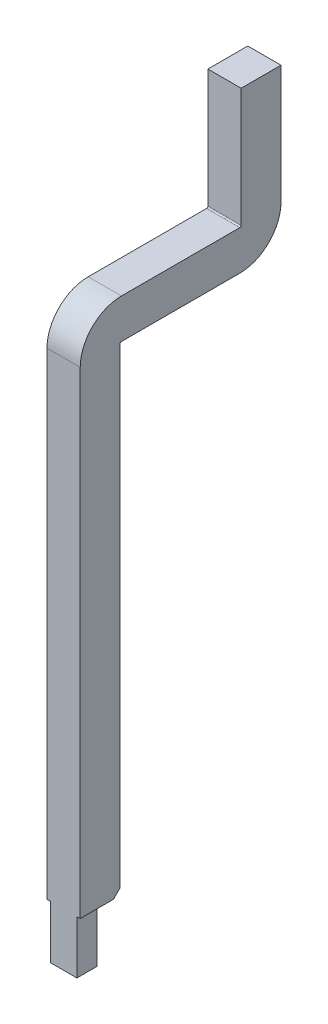
ISO-10303-21;
HEADER;
FILE_DESCRIPTION(('STEP AP214'),'2;1');
FILE_NAME('part.step','',(''),(''),'','','');
FILE_SCHEMA(('AUTOMOTIVE_DESIGN { 1 0 10303 214 1 1 1 1 }'));
ENDSEC;
DATA;
#1=APPLICATION_CONTEXT('core data for automotive mechanical design processes');
#2=APPLICATION_PROTOCOL_DEFINITION('international standard','automotive_design',2000,#1);
#3=PRODUCT_CONTEXT('',#1,'mechanical');
#4=PRODUCT('Part','Part','',(#3));
#5=PRODUCT_RELATED_PRODUCT_CATEGORY('part','',(#4));
#6=PRODUCT_DEFINITION_FORMATION('','',#4);
#7=PRODUCT_DEFINITION_CONTEXT('part definition',#1,'design');
#8=PRODUCT_DEFINITION('design','',#6,#7);
#9=PRODUCT_DEFINITION_SHAPE('','',#8);
#10=(LENGTH_UNIT() NAMED_UNIT(*) SI_UNIT(.MILLI.,.METRE.));
#11=(NAMED_UNIT(*) PLANE_ANGLE_UNIT() SI_UNIT($,.RADIAN.));
#12=(NAMED_UNIT(*) SI_UNIT($,.STERADIAN.) SOLID_ANGLE_UNIT());
#13=UNCERTAINTY_MEASURE_WITH_UNIT(LENGTH_MEASURE(1.E-05),#10,'distance_accuracy_value','');
#14=(GEOMETRIC_REPRESENTATION_CONTEXT(3) GLOBAL_UNCERTAINTY_ASSIGNED_CONTEXT((#13)) GLOBAL_UNIT_ASSIGNED_CONTEXT((#10,
#11,#12)) REPRESENTATION_CONTEXT('',''));
#15=CARTESIAN_POINT('',(0.,0.,0.));
#16=DIRECTION('',(0.,0.,1.));
#17=DIRECTION('',(1.,0.,0.));
#18=AXIS2_PLACEMENT_3D('',#15,#16,#17);
#19=CARTESIAN_POINT('',(0.,-2.196565371946,0.));
#20=DIRECTION('',(0.,-1.,0.));
#21=DIRECTION('',(0.,0.,-1.));
#22=AXIS2_PLACEMENT_3D('',#19,#20,#21);
#23=PLANE('',#22);
#24=DIRECTION('',(1.,0.,0.));
#25=VECTOR('',#24,1.);
#26=CARTESIAN_POINT('',(-0.1,-2.196565371946,0.605));
#27=LINE('',#26,#25);
#28=CARTESIAN_POINT('',(-0.1,-2.196565371946,0.605));
#29=VERTEX_POINT('',#28);
#30=CARTESIAN_POINT('',(0.1,-2.196565371946,0.605));
#31=VERTEX_POINT('',#30);
#32=EDGE_CURVE('E216',#29,#31,#27,.T.);
#33=ORIENTED_EDGE('',*,*,#32,.T.);
#34=DIRECTION('',(0.,0.,1.));
#35=VECTOR('',#34,1.);
#36=CARTESIAN_POINT('',(0.1,-2.196565371946,0.605));
#37=LINE('',#36,#35);
#38=CARTESIAN_POINT('',(0.1,-2.196565371946,0.755));
#39=VERTEX_POINT('',#38);
#40=EDGE_CURVE('E213',#31,#39,#37,.T.);
#41=ORIENTED_EDGE('',*,*,#40,.T.);
#42=DIRECTION('',(1.,0.,0.));
#43=VECTOR('',#42,1.);
#44=CARTESIAN_POINT('',(0.125,-2.196565371946,0.755));
#45=LINE('',#44,#43);
#46=CARTESIAN_POINT('',(-0.1,-2.196565371946,0.755));
#47=VERTEX_POINT('',#46);
#48=EDGE_CURVE('E174',#47,#39,#45,.T.);
#49=ORIENTED_EDGE('',*,*,#48,.F.);
#50=DIRECTION('',(0.,0.,-1.));
#51=VECTOR('',#50,1.);
#52=CARTESIAN_POINT('',(-0.1,-2.196565371946,0.755));
#53=LINE('',#52,#51);
#54=EDGE_CURVE('E226',#47,#29,#53,.T.);
#55=ORIENTED_EDGE('',*,*,#54,.T.);
#56=EDGE_LOOP('',(#33,#41,#49,#55));
#57=FACE_BOUND('',#56,.T.);
#58=ADVANCED_FACE('F17',(#57),#23,.T.);
#59=CARTESIAN_POINT('',(-0.125,1.793434628054,0.445));
#60=DIRECTION('',(-1.,0.,0.));
#61=DIRECTION('',(0.,0.,1.));
#62=AXIS2_PLACEMENT_3D('',#59,#60,#61);
#63=PLANE('',#62);
#64=DIRECTION('',(0.,0.,-1.));
#65=VECTOR('',#64,1.);
#66=CARTESIAN_POINT('',(-0.125,1.806565371946,-0.445));
#67=LINE('',#66,#65);
#68=CARTESIAN_POINT('',(-0.125,1.806565371946,0.445));
#69=VERTEX_POINT('',#68);
#70=CARTESIAN_POINT('',(-0.125,1.806565371946,-0.445));
#71=VERTEX_POINT('',#70);
#72=EDGE_CURVE('E191',#69,#71,#67,.T.);
#73=ORIENTED_EDGE('',*,*,#72,.F.);
#74=CARTESIAN_POINT('',(-0.125,1.796565371946,0.445));
#75=DIRECTION('',(1.,0.,0.));
#76=DIRECTION('',(0.,0.,-1.));
#77=AXIS2_PLACEMENT_3D('',#74,#75,#76);
#78=CIRCLE('',#77,0.01);
#79=CARTESIAN_POINT('',(-0.125,1.796565371946,0.455));
#80=VERTEX_POINT('',#79);
#81=EDGE_CURVE('E184',#69,#80,#78,.T.);
#82=ORIENTED_EDGE('',*,*,#81,.T.);
#83=DIRECTION('',(0.,1.,0.));
#84=VECTOR('',#83,1.);
#85=CARTESIAN_POINT('',(-0.125,1.796565371946,0.455));
#86=LINE('',#85,#84);
#87=CARTESIAN_POINT('',(-0.125,-1.746565371946,0.455));
#88=VERTEX_POINT('',#87);
#89=EDGE_CURVE('E181',#88,#80,#86,.T.);
#90=ORIENTED_EDGE('',*,*,#89,.F.);
#91=DIRECTION('',(0.,-0.707106781186548,0.707106781186547));
#92=VECTOR('',#91,1.);
#93=CARTESIAN_POINT('',(-0.125,-1.746565371946,0.455));
#94=LINE('',#93,#92);
#95=CARTESIAN_POINT('',(-0.125,-1.796565371946,0.505));
#96=VERTEX_POINT('',#95);
#97=EDGE_CURVE('E187',#88,#96,#94,.T.);
#98=ORIENTED_EDGE('',*,*,#97,.T.);
#99=DIRECTION('',(0.,0.,1.));
#100=VECTOR('',#99,1.);
#101=CARTESIAN_POINT('',(-0.125,-1.796565371946,0.445));
#102=LINE('',#101,#100);
#103=CARTESIAN_POINT('',(-0.125,-1.796565371946,0.755));
#104=VERTEX_POINT('',#103);
#105=EDGE_CURVE('E149',#96,#104,#102,.T.);
#106=ORIENTED_EDGE('',*,*,#105,.T.);
#107=DIRECTION('',(0.,-1.,0.));
#108=VECTOR('',#107,1.);
#109=CARTESIAN_POINT('',(-0.125,-1.796565371946,0.755));
#110=LINE('',#109,#108);
#111=CARTESIAN_POINT('',(-0.125,1.793434628054,0.755));
#112=VERTEX_POINT('',#111);
#113=EDGE_CURVE('E147',#112,#104,#110,.T.);
#114=ORIENTED_EDGE('',*,*,#113,.F.);
#115=CARTESIAN_POINT('',(-0.125,1.793434628054,0.445));
#116=DIRECTION('',(1.,0.,0.));
#117=DIRECTION('',(0.,0.,-1.));
#118=AXIS2_PLACEMENT_3D('',#115,#116,#117);
#119=CIRCLE('',#118,0.31);
#120=CARTESIAN_POINT('',(-0.125,2.103434628054,0.445));
#121=VERTEX_POINT('',#120);
#122=EDGE_CURVE('E20',#121,#112,#119,.T.);
#123=ORIENTED_EDGE('',*,*,#122,.F.);
#124=DIRECTION('',(0.,0.,1.));
#125=VECTOR('',#124,1.);
#126=CARTESIAN_POINT('',(-0.125,2.103434628054,0.445));
#127=LINE('',#126,#125);
#128=CARTESIAN_POINT('',(-0.125,2.103434628054,-0.445));
#129=VERTEX_POINT('',#128);
#130=EDGE_CURVE('E132',#129,#121,#127,.T.);
#131=ORIENTED_EDGE('',*,*,#130,.F.);
#132=CARTESIAN_POINT('',(-0.125,2.113434628054,-0.445));
#133=DIRECTION('',(1.,0.,0.));
#134=DIRECTION('',(0.,0.,-1.));
#135=AXIS2_PLACEMENT_3D('',#132,#133,#134);
#136=CIRCLE('',#135,0.01);
#137=CARTESIAN_POINT('',(-0.125,2.113434628054,-0.455));
#138=VERTEX_POINT('',#137);
#139=EDGE_CURVE('E208',#129,#138,#136,.T.);
#140=ORIENTED_EDGE('',*,*,#139,.T.);
#141=DIRECTION('',(0.,1.,0.));
#142=VECTOR('',#141,1.);
#143=CARTESIAN_POINT('',(-0.125,2.113434628054,-0.455));
#144=LINE('',#143,#142);
#145=CARTESIAN_POINT('',(-0.125,3.006565371946,-0.455));
#146=VERTEX_POINT('',#145);
#147=EDGE_CURVE('E206',#146,#138,#144,.F.);
#148=ORIENTED_EDGE('',*,*,#147,.F.);
#149=DIRECTION('',(0.,0.,1.));
#150=VECTOR('',#149,1.);
#151=CARTESIAN_POINT('',(-0.125,3.006565371946,-0.455));
#152=LINE('',#151,#150);
#153=CARTESIAN_POINT('',(-0.125,3.006565371946,-0.755));
#154=VERTEX_POINT('',#153);
#155=EDGE_CURVE('E201',#154,#146,#152,.T.);
#156=ORIENTED_EDGE('',*,*,#155,.F.);
#157=DIRECTION('',(0.,1.,0.));
#158=VECTOR('',#157,1.);
#159=CARTESIAN_POINT('',(-0.125,3.006565371946,-0.755));
#160=LINE('',#159,#158);
#161=CARTESIAN_POINT('',(-0.125,2.116565371946,-0.755));
#162=VERTEX_POINT('',#161);
#163=EDGE_CURVE('E195',#162,#154,#160,.T.);
#164=ORIENTED_EDGE('',*,*,#163,.F.);
#165=CARTESIAN_POINT('',(-0.125,2.116565371946,-0.445));
#166=DIRECTION('',(1.,0.,0.));
#167=DIRECTION('',(0.,0.,-1.));
#168=AXIS2_PLACEMENT_3D('',#165,#166,#167);
#169=CIRCLE('',#168,0.31);
#170=EDGE_CURVE('E278',#71,#162,#169,.T.);
#171=ORIENTED_EDGE('',*,*,#170,.F.);
#172=EDGE_LOOP('',(#73,#82,#90,#98,#106,#114,#123,#131,#140,#148,#156,#164,#171));
#173=FACE_BOUND('',#172,.T.);
#174=ADVANCED_FACE('F148',(#173),#63,.T.);
#175=CARTESIAN_POINT('',(0.1,-2.196565371946,0.605));
#176=DIRECTION('',(-1.,0.,0.));
#177=DIRECTION('',(0.,0.,1.));
#178=AXIS2_PLACEMENT_3D('',#175,#176,#177);
#179=PLANE('',#178);
#180=DIRECTION('',(0.,-1.,0.));
#181=VECTOR('',#180,1.);
#182=CARTESIAN_POINT('',(0.1,-1.796565371946,0.755));
#183=LINE('',#182,#181);
#184=CARTESIAN_POINT('',(0.1,-1.796565371946,0.755));
#185=VERTEX_POINT('',#184);
#186=EDGE_CURVE('E145',#39,#185,#183,.F.);
#187=ORIENTED_EDGE('',*,*,#186,.F.);
#188=ORIENTED_EDGE('',*,*,#40,.F.);
#189=DIRECTION('',(0.,1.,0.));
#190=VECTOR('',#189,1.);
#191=CARTESIAN_POINT('',(0.1,-2.196565371946,0.605));
#192=LINE('',#191,#190);
#193=CARTESIAN_POINT('',(0.1,-1.796565371946,0.605));
#194=VERTEX_POINT('',#193);
#195=EDGE_CURVE('E229',#31,#194,#192,.T.);
#196=ORIENTED_EDGE('',*,*,#195,.T.);
#197=DIRECTION('',(0.,0.,-1.));
#198=VECTOR('',#197,1.);
#199=CARTESIAN_POINT('',(0.1,-1.796565371946,0.455));
#200=LINE('',#199,#198);
#201=EDGE_CURVE('E168',#185,#194,#200,.T.);
#202=ORIENTED_EDGE('',*,*,#201,.F.);
#203=EDGE_LOOP('',(#187,#188,#196,#202));
#204=FACE_BOUND('',#203,.T.);
#205=ADVANCED_FACE('F503',(#204),#179,.F.);
#206=CARTESIAN_POINT('',(-0.1,-2.196565371946,0.605));
#207=DIRECTION('',(0.,0.,1.));
#208=DIRECTION('',(1.,0.,0.));
#209=AXIS2_PLACEMENT_3D('',#206,#207,#208);
#210=PLANE('',#209);
#211=ORIENTED_EDGE('',*,*,#195,.F.);
#212=ORIENTED_EDGE('',*,*,#32,.F.);
#213=DIRECTION('',(0.,1.,0.));
#214=VECTOR('',#213,1.);
#215=CARTESIAN_POINT('',(-0.1,-2.196565371946,0.605));
#216=LINE('',#215,#214);
#217=CARTESIAN_POINT('',(-0.1,-1.796565371946,0.605));
#218=VERTEX_POINT('',#217);
#219=EDGE_CURVE('E154',#29,#218,#216,.T.);
#220=ORIENTED_EDGE('',*,*,#219,.T.);
#221=DIRECTION('',(1.,0.,0.));
#222=VECTOR('',#221,1.);
#223=CARTESIAN_POINT('',(0.125,-1.796565371946,0.605));
#224=LINE('',#223,#222);
#225=EDGE_CURVE('E178',#194,#218,#224,.F.);
#226=ORIENTED_EDGE('',*,*,#225,.F.);
#227=EDGE_LOOP('',(#211,#212,#220,#226));
#228=FACE_BOUND('',#227,.T.);
#229=ADVANCED_FACE('F494',(#228),#210,.F.);
#230=CARTESIAN_POINT('',(-0.1,-2.196565371946,0.755));
#231=DIRECTION('',(1.,0.,0.));
#232=DIRECTION('',(0.,0.,-1.));
#233=AXIS2_PLACEMENT_3D('',#230,#231,#232);
#234=PLANE('',#233);
#235=ORIENTED_EDGE('',*,*,#219,.F.);
#236=ORIENTED_EDGE('',*,*,#54,.F.);
#237=DIRECTION('',(0.,-1.,0.));
#238=VECTOR('',#237,1.);
#239=CARTESIAN_POINT('',(-0.1,-1.796565371946,0.755));
#240=LINE('',#239,#238);
#241=CARTESIAN_POINT('',(-0.1,-1.796565371946,0.755));
#242=VERTEX_POINT('',#241);
#243=EDGE_CURVE('E153',#242,#47,#240,.T.);
#244=ORIENTED_EDGE('',*,*,#243,.F.);
#245=DIRECTION('',(0.,0.,-1.));
#246=VECTOR('',#245,1.);
#247=CARTESIAN_POINT('',(-0.1,-1.796565371946,0.455));
#248=LINE('',#247,#246);
#249=EDGE_CURVE('E232',#218,#242,#248,.F.);
#250=ORIENTED_EDGE('',*,*,#249,.F.);
#251=EDGE_LOOP('',(#235,#236,#244,#250));
#252=FACE_BOUND('',#251,.T.);
#253=ADVANCED_FACE('F486',(#252),#234,.F.);
#254=CARTESIAN_POINT('',(0.125,-1.796565371946,0.755));
#255=DIRECTION('',(0.,0.,1.));
#256=DIRECTION('',(0.,-1.,0.));
#257=AXIS2_PLACEMENT_3D('',#254,#255,#256);
#258=PLANE('',#257);
#259=DIRECTION('',(0.,1.,0.));
#260=VECTOR('',#259,1.);
#261=CARTESIAN_POINT('',(0.125,1.793434628054,0.755));
#262=LINE('',#261,#260);
#263=CARTESIAN_POINT('',(0.125,-1.796565371946,0.755));
#264=VERTEX_POINT('',#263);
#265=CARTESIAN_POINT('',(0.125,1.793434628054,0.755));
#266=VERTEX_POINT('',#265);
#267=EDGE_CURVE('E159',#264,#266,#262,.T.);
#268=ORIENTED_EDGE('',*,*,#267,.T.);
#269=DIRECTION('',(1.,0.,0.));
#270=VECTOR('',#269,1.);
#271=CARTESIAN_POINT('',(0.125,1.793434628054,0.755));
#272=LINE('',#271,#270);
#273=EDGE_CURVE('E141',#112,#266,#272,.T.);
#274=ORIENTED_EDGE('',*,*,#273,.F.);
#275=ORIENTED_EDGE('',*,*,#113,.T.);
#276=DIRECTION('',(1.,0.,0.));
#277=VECTOR('',#276,1.);
#278=CARTESIAN_POINT('',(0.125,-1.796565371946,0.755));
#279=LINE('',#278,#277);
#280=EDGE_CURVE('E234',#242,#104,#279,.F.);
#281=ORIENTED_EDGE('',*,*,#280,.F.);
#282=ORIENTED_EDGE('',*,*,#243,.T.);
#283=ORIENTED_EDGE('',*,*,#48,.T.);
#284=ORIENTED_EDGE('',*,*,#186,.T.);
#285=DIRECTION('',(1.,0.,0.));
#286=VECTOR('',#285,1.);
#287=CARTESIAN_POINT('',(0.125,-1.796565371946,0.755));
#288=LINE('',#287,#286);
#289=EDGE_CURVE('E165',#264,#185,#288,.F.);
#290=ORIENTED_EDGE('',*,*,#289,.F.);
#291=EDGE_LOOP('',(#268,#274,#275,#281,#282,#283,#284,#290));
#292=FACE_BOUND('',#291,.T.);
#293=ADVANCED_FACE('F157',(#292),#258,.T.);
#294=CARTESIAN_POINT('',(0.125,1.793434628054,0.445));
#295=DIRECTION('',(1.,0.,0.));
#296=DIRECTION('',(0.,0.,-1.));
#297=AXIS2_PLACEMENT_3D('',#294,#295,#296);
#298=CYLINDRICAL_SURFACE('',#297,0.31);
#299=CARTESIAN_POINT('',(0.125,1.793434628054,0.445));
#300=DIRECTION('',(1.,0.,0.));
#301=DIRECTION('',(0.,0.,-1.));
#302=AXIS2_PLACEMENT_3D('',#299,#300,#301);
#303=CIRCLE('',#302,0.31);
#304=CARTESIAN_POINT('',(0.125,2.103434628054,0.445));
#305=VERTEX_POINT('',#304);
#306=EDGE_CURVE('E273',#266,#305,#303,.F.);
#307=ORIENTED_EDGE('',*,*,#306,.T.);
#308=DIRECTION('',(1.,0.,0.));
#309=VECTOR('',#308,1.);
#310=CARTESIAN_POINT('',(0.125,2.103434628054,0.445));
#311=LINE('',#310,#309);
#312=EDGE_CURVE('E143',#121,#305,#311,.T.);
#313=ORIENTED_EDGE('',*,*,#312,.F.);
#314=ORIENTED_EDGE('',*,*,#122,.T.);
#315=ORIENTED_EDGE('',*,*,#273,.T.);
#316=EDGE_LOOP('',(#307,#313,#314,#315));
#317=FACE_BOUND('',#316,.T.);
#318=ADVANCED_FACE('F139',(#317),#298,.T.);
#319=CARTESIAN_POINT('',(0.125,2.103434628054,0.445));
#320=DIRECTION('',(0.,1.,0.));
#321=DIRECTION('',(0.,0.,1.));
#322=AXIS2_PLACEMENT_3D('',#319,#320,#321);
#323=PLANE('',#322);
#324=DIRECTION('',(0.,0.,1.));
#325=VECTOR('',#324,1.);
#326=CARTESIAN_POINT('',(0.125,2.103434628054,0.445));
#327=LINE('',#326,#325);
#328=CARTESIAN_POINT('',(0.125,2.103434628054,-0.445));
#329=VERTEX_POINT('',#328);
#330=EDGE_CURVE('E272',#305,#329,#327,.F.);
#331=ORIENTED_EDGE('',*,*,#330,.T.);
#332=DIRECTION('',(1.,0.,0.));
#333=VECTOR('',#332,1.);
#334=CARTESIAN_POINT('',(0.125,2.103434628054,-0.445));
#335=LINE('',#334,#333);
#336=EDGE_CURVE('E280',#329,#129,#335,.F.);
#337=ORIENTED_EDGE('',*,*,#336,.T.);
#338=ORIENTED_EDGE('',*,*,#130,.T.);
#339=ORIENTED_EDGE('',*,*,#312,.T.);
#340=EDGE_LOOP('',(#331,#337,#338,#339));
#341=FACE_BOUND('',#340,.T.);
#342=ADVANCED_FACE('F367',(#341),#323,.T.);
#343=CARTESIAN_POINT('',(0.125,2.113434628054,-0.445));
#344=DIRECTION('',(1.,0.,0.));
#345=DIRECTION('',(0.,0.,-1.));
#346=AXIS2_PLACEMENT_3D('',#343,#344,#345);
#347=CYLINDRICAL_SURFACE('',#346,0.01);
#348=ORIENTED_EDGE('',*,*,#336,.F.);
#349=CARTESIAN_POINT('',(0.125,2.113434628054,-0.445));
#350=DIRECTION('',(1.,0.,0.));
#351=DIRECTION('',(0.,0.,-1.));
#352=AXIS2_PLACEMENT_3D('',#349,#350,#351);
#353=CIRCLE('',#352,0.01);
#354=CARTESIAN_POINT('',(0.125,2.113434628054,-0.455));
#355=VERTEX_POINT('',#354);
#356=EDGE_CURVE('E268',#329,#355,#353,.T.);
#357=ORIENTED_EDGE('',*,*,#356,.T.);
#358=DIRECTION('',(1.,0.,0.));
#359=VECTOR('',#358,1.);
#360=CARTESIAN_POINT('',(0.125,2.113434628054,-0.455));
#361=LINE('',#360,#359);
#362=EDGE_CURVE('E203',#138,#355,#361,.T.);
#363=ORIENTED_EDGE('',*,*,#362,.F.);
#364=ORIENTED_EDGE('',*,*,#139,.F.);
#365=EDGE_LOOP('',(#348,#357,#363,#364));
#366=FACE_BOUND('',#365,.T.);
#367=ADVANCED_FACE('F365',(#366),#347,.F.);
#368=CARTESIAN_POINT('',(0.125,2.113434628054,-0.455));
#369=DIRECTION('',(0.,0.,1.));
#370=DIRECTION('',(1.,0.,0.));
#371=AXIS2_PLACEMENT_3D('',#368,#369,#370);
#372=PLANE('',#371);
#373=DIRECTION('',(0.,1.,0.));
#374=VECTOR('',#373,1.);
#375=CARTESIAN_POINT('',(0.125,1.793434628054,-0.455));
#376=LINE('',#375,#374);
#377=CARTESIAN_POINT('',(0.125,3.006565371946,-0.455));
#378=VERTEX_POINT('',#377);
#379=EDGE_CURVE('E271',#355,#378,#376,.T.);
#380=ORIENTED_EDGE('',*,*,#379,.T.);
#381=DIRECTION('',(1.,0.,0.));
#382=VECTOR('',#381,1.);
#383=CARTESIAN_POINT('',(0.125,3.006565371946,-0.455));
#384=LINE('',#383,#382);
#385=EDGE_CURVE('E198',#146,#378,#384,.T.);
#386=ORIENTED_EDGE('',*,*,#385,.F.);
#387=ORIENTED_EDGE('',*,*,#147,.T.);
#388=ORIENTED_EDGE('',*,*,#362,.T.);
#389=EDGE_LOOP('',(#380,#386,#387,#388));
#390=FACE_BOUND('',#389,.T.);
#391=ADVANCED_FACE('F361',(#390),#372,.T.);
#392=CARTESIAN_POINT('',(0.125,3.006565371946,-0.455));
#393=DIRECTION('',(0.,1.,0.));
#394=DIRECTION('',(0.,0.,1.));
#395=AXIS2_PLACEMENT_3D('',#392,#393,#394);
#396=PLANE('',#395);
#397=DIRECTION('',(0.,0.,1.));
#398=VECTOR('',#397,1.);
#399=CARTESIAN_POINT('',(0.125,3.006565371946,0.445));
#400=LINE('',#399,#398);
#401=CARTESIAN_POINT('',(0.125,3.006565371946,-0.755));
#402=VERTEX_POINT('',#401);
#403=EDGE_CURVE('E292',#378,#402,#400,.F.);
#404=ORIENTED_EDGE('',*,*,#403,.T.);
#405=DIRECTION('',(-1.,0.,0.));
#406=VECTOR('',#405,1.);
#407=CARTESIAN_POINT('',(0.125,3.006565371946,-0.755));
#408=LINE('',#407,#406);
#409=EDGE_CURVE('E197',#154,#402,#408,.F.);
#410=ORIENTED_EDGE('',*,*,#409,.F.);
#411=ORIENTED_EDGE('',*,*,#155,.T.);
#412=ORIENTED_EDGE('',*,*,#385,.T.);
#413=EDGE_LOOP('',(#404,#410,#411,#412));
#414=FACE_BOUND('',#413,.T.);
#415=ADVANCED_FACE('F358',(#414),#396,.T.);
#416=CARTESIAN_POINT('',(0.125,3.006565371946,-0.755));
#417=DIRECTION('',(0.,0.,-1.));
#418=DIRECTION('',(-1.,0.,0.));
#419=AXIS2_PLACEMENT_3D('',#416,#417,#418);
#420=PLANE('',#419);
#421=DIRECTION('',(0.,1.,0.));
#422=VECTOR('',#421,1.);
#423=CARTESIAN_POINT('',(0.125,1.793434628054,-0.755));
#424=LINE('',#423,#422);
#425=CARTESIAN_POINT('',(0.125,2.116565371946,-0.755));
#426=VERTEX_POINT('',#425);
#427=EDGE_CURVE('E267',#402,#426,#424,.F.);
#428=ORIENTED_EDGE('',*,*,#427,.T.);
#429=DIRECTION('',(1.,0.,0.));
#430=VECTOR('',#429,1.);
#431=CARTESIAN_POINT('',(0.125,2.116565371946,-0.755));
#432=LINE('',#431,#430);
#433=EDGE_CURVE('E194',#162,#426,#432,.T.);
#434=ORIENTED_EDGE('',*,*,#433,.F.);
#435=ORIENTED_EDGE('',*,*,#163,.T.);
#436=ORIENTED_EDGE('',*,*,#409,.T.);
#437=EDGE_LOOP('',(#428,#434,#435,#436));
#438=FACE_BOUND('',#437,.T.);
#439=ADVANCED_FACE('F352',(#438),#420,.T.);
#440=CARTESIAN_POINT('',(0.125,2.116565371946,-0.445));
#441=DIRECTION('',(1.,0.,0.));
#442=DIRECTION('',(0.,0.,-1.));
#443=AXIS2_PLACEMENT_3D('',#440,#441,#442);
#444=CYLINDRICAL_SURFACE('',#443,0.31);
#445=CARTESIAN_POINT('',(0.125,2.116565371946,-0.445));
#446=DIRECTION('',(1.,0.,0.));
#447=DIRECTION('',(0.,0.,-1.));
#448=AXIS2_PLACEMENT_3D('',#445,#446,#447);
#449=CIRCLE('',#448,0.31);
#450=CARTESIAN_POINT('',(0.125,1.806565371946,-0.445));
#451=VERTEX_POINT('',#450);
#452=EDGE_CURVE('E264',#426,#451,#449,.F.);
#453=ORIENTED_EDGE('',*,*,#452,.T.);
#454=DIRECTION('',(1.,0.,0.));
#455=VECTOR('',#454,1.);
#456=CARTESIAN_POINT('',(0.125,1.806565371946,-0.445));
#457=LINE('',#456,#455);
#458=EDGE_CURVE('E193',#71,#451,#457,.T.);
#459=ORIENTED_EDGE('',*,*,#458,.F.);
#460=ORIENTED_EDGE('',*,*,#170,.T.);
#461=ORIENTED_EDGE('',*,*,#433,.T.);
#462=EDGE_LOOP('',(#453,#459,#460,#461));
#463=FACE_BOUND('',#462,.T.);
#464=ADVANCED_FACE('F348',(#463),#444,.T.);
#465=CARTESIAN_POINT('',(0.125,1.806565371946,-0.445));
#466=DIRECTION('',(0.,-1.,0.));
#467=DIRECTION('',(0.,0.,-1.));
#468=AXIS2_PLACEMENT_3D('',#465,#466,#467);
#469=PLANE('',#468);
#470=DIRECTION('',(0.,0.,1.));
#471=VECTOR('',#470,1.);
#472=CARTESIAN_POINT('',(0.125,1.806565371946,0.445));
#473=LINE('',#472,#471);
#474=CARTESIAN_POINT('',(0.125,1.806565371946,0.445));
#475=VERTEX_POINT('',#474);
#476=EDGE_CURVE('E263',#451,#475,#473,.T.);
#477=ORIENTED_EDGE('',*,*,#476,.T.);
#478=DIRECTION('',(1.,0.,0.));
#479=VECTOR('',#478,1.);
#480=CARTESIAN_POINT('',(0.125,1.806565371946,0.445));
#481=LINE('',#480,#479);
#482=EDGE_CURVE('E277',#475,#69,#481,.F.);
#483=ORIENTED_EDGE('',*,*,#482,.T.);
#484=ORIENTED_EDGE('',*,*,#72,.T.);
#485=ORIENTED_EDGE('',*,*,#458,.T.);
#486=EDGE_LOOP('',(#477,#483,#484,#485));
#487=FACE_BOUND('',#486,.T.);
#488=ADVANCED_FACE('F342',(#487),#469,.T.);
#489=CARTESIAN_POINT('',(0.125,1.796565371946,0.445));
#490=DIRECTION('',(1.,0.,0.));
#491=DIRECTION('',(0.,0.,-1.));
#492=AXIS2_PLACEMENT_3D('',#489,#490,#491);
#493=CYLINDRICAL_SURFACE('',#492,0.01);
#494=ORIENTED_EDGE('',*,*,#482,.F.);
#495=CARTESIAN_POINT('',(0.125,1.796565371946,0.445));
#496=DIRECTION('',(1.,0.,0.));
#497=DIRECTION('',(0.,0.,-1.));
#498=AXIS2_PLACEMENT_3D('',#495,#496,#497);
#499=CIRCLE('',#498,0.01);
#500=CARTESIAN_POINT('',(0.125,1.796565371946,0.455));
#501=VERTEX_POINT('',#500);
#502=EDGE_CURVE('E259',#475,#501,#499,.T.);
#503=ORIENTED_EDGE('',*,*,#502,.T.);
#504=DIRECTION('',(1.,0.,0.));
#505=VECTOR('',#504,1.);
#506=CARTESIAN_POINT('',(0.125,1.796565371946,0.455));
#507=LINE('',#506,#505);
#508=EDGE_CURVE('E183',#80,#501,#507,.T.);
#509=ORIENTED_EDGE('',*,*,#508,.F.);
#510=ORIENTED_EDGE('',*,*,#81,.F.);
#511=EDGE_LOOP('',(#494,#503,#509,#510));
#512=FACE_BOUND('',#511,.T.);
#513=ADVANCED_FACE('F339',(#512),#493,.F.);
#514=CARTESIAN_POINT('',(0.125,1.796565371946,0.455));
#515=DIRECTION('',(0.,0.,-1.));
#516=DIRECTION('',(0.,1.,0.));
#517=AXIS2_PLACEMENT_3D('',#514,#515,#516);
#518=PLANE('',#517);
#519=ORIENTED_EDGE('',*,*,#89,.T.);
#520=ORIENTED_EDGE('',*,*,#508,.T.);
#521=DIRECTION('',(0.,1.,0.));
#522=VECTOR('',#521,1.);
#523=CARTESIAN_POINT('',(0.125,1.793434628054,0.455));
#524=LINE('',#523,#522);
#525=CARTESIAN_POINT('',(0.125,-1.746565371946,0.455));
#526=VERTEX_POINT('',#525);
#527=EDGE_CURVE('E262',#501,#526,#524,.F.);
#528=ORIENTED_EDGE('',*,*,#527,.T.);
#529=DIRECTION('',(1.,0.,0.));
#530=VECTOR('',#529,1.);
#531=CARTESIAN_POINT('',(0.125,-1.746565371946,0.455));
#532=LINE('',#531,#530);
#533=EDGE_CURVE('E256',#526,#88,#532,.F.);
#534=ORIENTED_EDGE('',*,*,#533,.T.);
#535=EDGE_LOOP('',(#519,#520,#528,#534));
#536=FACE_BOUND('',#535,.T.);
#537=ADVANCED_FACE('F331',(#536),#518,.T.);
#538=CARTESIAN_POINT('',(0.125,-1.746565371946,0.455));
#539=DIRECTION('',(0.,0.707106781186548,0.707106781186548));
#540=DIRECTION('',(0.,-0.707106781186548,0.707106781186548));
#541=AXIS2_PLACEMENT_3D('',#538,#539,#540);
#542=PLANE('',#541);
#543=DIRECTION('',(1.,0.,0.));
#544=VECTOR('',#543,1.);
#545=CARTESIAN_POINT('',(0.125,-1.796565371946,0.505));
#546=LINE('',#545,#544);
#547=CARTESIAN_POINT('',(0.125,-1.796565371946,0.505));
#548=VERTEX_POINT('',#547);
#549=EDGE_CURVE('E34',#96,#548,#546,.T.);
#550=ORIENTED_EDGE('',*,*,#549,.F.);
#551=ORIENTED_EDGE('',*,*,#97,.F.);
#552=ORIENTED_EDGE('',*,*,#533,.F.);
#553=DIRECTION('',(0.,-0.707106781186548,0.707106781186547));
#554=VECTOR('',#553,1.);
#555=CARTESIAN_POINT('',(0.125,-1.746565371946,0.455));
#556=LINE('',#555,#554);
#557=EDGE_CURVE('E26',#526,#548,#556,.T.);
#558=ORIENTED_EDGE('',*,*,#557,.T.);
#559=EDGE_LOOP('',(#550,#551,#552,#558));
#560=FACE_BOUND('',#559,.T.);
#561=ADVANCED_FACE('F382',(#560),#542,.F.);
#562=CARTESIAN_POINT('',(0.125,-1.796565371946,0.455));
#563=DIRECTION('',(0.,-1.,0.));
#564=DIRECTION('',(0.,0.,-1.));
#565=AXIS2_PLACEMENT_3D('',#562,#563,#564);
#566=PLANE('',#565);
#567=ORIENTED_EDGE('',*,*,#249,.T.);
#568=ORIENTED_EDGE('',*,*,#280,.T.);
#569=ORIENTED_EDGE('',*,*,#105,.F.);
#570=ORIENTED_EDGE('',*,*,#549,.T.);
#571=DIRECTION('',(0.,0.,1.));
#572=VECTOR('',#571,1.);
#573=CARTESIAN_POINT('',(0.125,-1.796565371946,0.445));
#574=LINE('',#573,#572);
#575=EDGE_CURVE('E11',#548,#264,#574,.T.);
#576=ORIENTED_EDGE('',*,*,#575,.T.);
#577=ORIENTED_EDGE('',*,*,#289,.T.);
#578=ORIENTED_EDGE('',*,*,#201,.T.);
#579=ORIENTED_EDGE('',*,*,#225,.T.);
#580=EDGE_LOOP('',(#567,#568,#569,#570,#576,#577,#578,#579));
#581=FACE_BOUND('',#580,.T.);
#582=ADVANCED_FACE('F377',(#581),#566,.T.);
#583=CARTESIAN_POINT('',(0.125,1.793434628054,0.445));
#584=DIRECTION('',(-1.,0.,0.));
#585=DIRECTION('',(0.,0.,1.));
#586=AXIS2_PLACEMENT_3D('',#583,#584,#585);
#587=PLANE('',#586);
#588=ORIENTED_EDGE('',*,*,#557,.F.);
#589=ORIENTED_EDGE('',*,*,#527,.F.);
#590=ORIENTED_EDGE('',*,*,#502,.F.);
#591=ORIENTED_EDGE('',*,*,#476,.F.);
#592=ORIENTED_EDGE('',*,*,#452,.F.);
#593=ORIENTED_EDGE('',*,*,#427,.F.);
#594=ORIENTED_EDGE('',*,*,#403,.F.);
#595=ORIENTED_EDGE('',*,*,#379,.F.);
#596=ORIENTED_EDGE('',*,*,#356,.F.);
#597=ORIENTED_EDGE('',*,*,#330,.F.);
#598=ORIENTED_EDGE('',*,*,#306,.F.);
#599=ORIENTED_EDGE('',*,*,#267,.F.);
#600=ORIENTED_EDGE('',*,*,#575,.F.);
#601=EDGE_LOOP('',(#588,#589,#590,#591,#592,#593,#594,#595,#596,#597,#598,#599,#600));
#602=FACE_BOUND('',#601,.T.);
#603=ADVANCED_FACE('F336',(#602),#587,.F.);
#604=CLOSED_SHELL('',(#58,#174,#205,#229,#253,#293,#318,#342,#367,#391,#415,#439,#464,#488,#513,
#537,#561,#582,#603));
#605=MANIFOLD_SOLID_BREP('B1',#604);
#606=ADVANCED_BREP_SHAPE_REPRESENTATION('',(#18,#605),#14);
#607=SHAPE_DEFINITION_REPRESENTATION(#9,#606);
ENDSEC;
END-ISO-10303-21;
